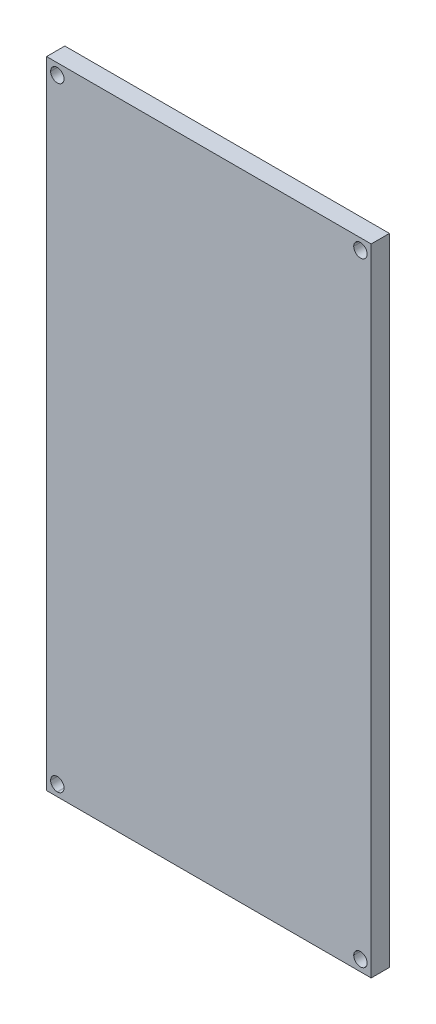
ISO-10303-21;
HEADER;
FILE_DESCRIPTION(('STEP AP214'),'2;1');
FILE_NAME('part.step','',(''),(''),'','','');
FILE_SCHEMA(('AUTOMOTIVE_DESIGN { 1 0 10303 214 1 1 1 1 }'));
ENDSEC;
DATA;
#1=APPLICATION_CONTEXT('core data for automotive mechanical design processes');
#2=APPLICATION_PROTOCOL_DEFINITION('international standard','automotive_design',2000,#1);
#3=PRODUCT_CONTEXT('',#1,'mechanical');
#4=PRODUCT('Part','Part','',(#3));
#5=PRODUCT_RELATED_PRODUCT_CATEGORY('part','',(#4));
#6=PRODUCT_DEFINITION_FORMATION('','',#4);
#7=PRODUCT_DEFINITION_CONTEXT('part definition',#1,'design');
#8=PRODUCT_DEFINITION('design','',#6,#7);
#9=PRODUCT_DEFINITION_SHAPE('','',#8);
#10=(LENGTH_UNIT() NAMED_UNIT(*) SI_UNIT(.MILLI.,.METRE.));
#11=(NAMED_UNIT(*) PLANE_ANGLE_UNIT() SI_UNIT($,.RADIAN.));
#12=(NAMED_UNIT(*) SI_UNIT($,.STERADIAN.) SOLID_ANGLE_UNIT());
#13=UNCERTAINTY_MEASURE_WITH_UNIT(LENGTH_MEASURE(1.E-05),#10,'distance_accuracy_value','');
#14=(GEOMETRIC_REPRESENTATION_CONTEXT(3) GLOBAL_UNCERTAINTY_ASSIGNED_CONTEXT((#13)) GLOBAL_UNIT_ASSIGNED_CONTEXT((#10,
#11,#12)) REPRESENTATION_CONTEXT('',''));
#15=CARTESIAN_POINT('',(0.,0.,0.));
#16=DIRECTION('',(0.,0.,1.));
#17=DIRECTION('',(1.,0.,0.));
#18=AXIS2_PLACEMENT_3D('',#15,#16,#17);
#19=CARTESIAN_POINT('',(1259.93549562021,-387.392888926091,4.5));
#20=CARTESIAN_POINT('',(1259.93549562019,-388.304113925863,4.5));
#21=CARTESIAN_POINT('',(1260.67414173114,-389.043077536789,4.50000000000039));
#22=CARTESIAN_POINT('',(1261.58568423091,-389.043077536792,4.50000000000039));
#23=CARTESIAN_POINT('',(1262.49659173068,-389.043077536789,4.50000000000039));
#24=CARTESIAN_POINT('',(1263.23590811937,-388.304113925863,4.50000000000039));
#25=CARTESIAN_POINT('',(1263.23590811938,-387.39288892609,4.50000000000039));
#26=B_SPLINE_CURVE_WITH_KNOTS('',3,(#19,#20,#21,#22,#23,#24,#25),.UNSPECIFIED.,.F.,.F.,(4,3,4),
(0.,1.,2.),.UNSPECIFIED.);
#27=DIRECTION('',(0.,0.,-1.));
#28=VECTOR('',#27,1.);
#29=SURFACE_OF_LINEAR_EXTRUSION('',#26,#28);
#30=CARTESIAN_POINT('',(1259.93549562021,-387.392888926091,4.16333634234434E-13));
#31=CARTESIAN_POINT('',(1259.93549562019,-388.304113925863,4.16333634234434E-13));
#32=CARTESIAN_POINT('',(1260.67414173114,-389.043077536789,6.93889390390723E-13));
#33=CARTESIAN_POINT('',(1261.58568423091,-389.043077536792,3.33066907387547E-13));
#34=CARTESIAN_POINT('',(1262.49659173068,-389.043077536789,3.33066907387547E-13));
#35=CARTESIAN_POINT('',(1263.23590811937,-388.304113925863,3.33066907387547E-13));
#36=CARTESIAN_POINT('',(1263.23590811938,-387.39288892609,3.33066907387547E-13));
#37=B_SPLINE_CURVE_WITH_KNOTS('',3,(#30,#31,#32,#33,#34,#35,#36),.UNSPECIFIED.,.F.,.F.,(4,3,4),
(0.,1.,2.),.UNSPECIFIED.);
#38=CARTESIAN_POINT('',(1260.41728361055,-388.558212669489,4.16333634234434E-13));
#39=VERTEX_POINT('',#38);
#40=CARTESIAN_POINT('',(1261.53167576148,-389.0422105581,3.33066907387547E-13));
#41=VERTEX_POINT('',#40);
#42=EDGE_CURVE('E206',#39,#41,#37,.T.);
#43=ORIENTED_EDGE('',*,*,#42,.F.);
#44=CARTESIAN_POINT('',(1260.41728361056,-388.55821266949,1.98625837999344E-13));
#45=CARTESIAN_POINT('',(1260.11954797213,-388.259686394422,1.01481323344643E-13));
#46=CARTESIAN_POINT('',(1259.9354956202,-387.847749300204,0.));
#47=CARTESIAN_POINT('',(1259.93549562021,-387.392888926091,0.));
#48=B_SPLINE_CURVE_WITH_KNOTS('',3,(#44,#45,#46,#47),.UNSPECIFIED.,.F.,.F.,(4,4),(0.,
0.499174599278034),.UNSPECIFIED.);
#49=CARTESIAN_POINT('',(1259.93549562021,-387.392888926091,4.16333634234434E-13));
#50=VERTEX_POINT('',#49);
#51=EDGE_CURVE('E499',#50,#39,#48,.F.);
#52=ORIENTED_EDGE('',*,*,#51,.F.);
#53=DIRECTION('',(0.,0.,-1.));
#54=VECTOR('',#53,1.);
#55=CARTESIAN_POINT('',(1259.93549562021,-387.392888926091,4.5));
#56=LINE('',#55,#54);
#57=CARTESIAN_POINT('',(1259.93549562021,-387.392888926091,4.5));
#58=VERTEX_POINT('',#57);
#59=EDGE_CURVE('E225',#58,#50,#56,.T.);
#60=ORIENTED_EDGE('',*,*,#59,.F.);
#61=CARTESIAN_POINT('',(1259.93549562021,-387.392888926091,4.5));
#62=CARTESIAN_POINT('',(1259.9354956202,-387.847749300204,4.5));
#63=CARTESIAN_POINT('',(1260.11954797213,-388.259686394421,4.5000000000001));
#64=CARTESIAN_POINT('',(1260.41728361056,-388.558212669489,4.5000000000002));
#65=B_SPLINE_CURVE_WITH_KNOTS('',3,(#61,#62,#63,#64),.UNSPECIFIED.,.F.,.F.,(4,4),(0.,
0.499174599277808),.UNSPECIFIED.);
#66=CARTESIAN_POINT('',(1260.41728361055,-388.558212669489,4.5));
#67=VERTEX_POINT('',#66);
#68=EDGE_CURVE('E217',#58,#67,#65,.T.);
#69=ORIENTED_EDGE('',*,*,#68,.T.);
#70=CARTESIAN_POINT('',(1261.53167576148,-389.0422105581,4.50000000000039));
#71=VERTEX_POINT('',#70);
#72=EDGE_CURVE('E212',#67,#71,#26,.T.);
#73=ORIENTED_EDGE('',*,*,#72,.T.);
#74=DIRECTION('',(0.,0.,-1.));
#75=VECTOR('',#74,1.);
#76=CARTESIAN_POINT('',(1261.53167576148,-389.0422105581,4.50000000000039));
#77=LINE('',#76,#75);
#78=EDGE_CURVE('E85',#41,#71,#77,.F.);
#79=ORIENTED_EDGE('',*,*,#78,.F.);
#80=EDGE_LOOP('',(#43,#52,#60,#69,#73,#79));
#81=FACE_BOUND('',#80,.T.);
#82=ADVANCED_FACE('F46',(#81),#29,.T.);
#83=DIRECTION('',(0.,0.,-1.));
#84=VECTOR('',#83,1.);
#85=CARTESIAN_POINT('',(1261.64384107452,-389.042070692619,4.50000000000039));
#86=LINE('',#85,#84);
#87=CARTESIAN_POINT('',(1261.64384107452,-389.042070692621,4.50000000000039));
#88=VERTEX_POINT('',#87);
#89=CARTESIAN_POINT('',(1261.64384107452,-389.042070692621,3.33066907387547E-13));
#90=VERTEX_POINT('',#89);
#91=EDGE_CURVE('E341',#88,#90,#86,.T.);
#92=ORIENTED_EDGE('',*,*,#91,.F.);
#93=CARTESIAN_POINT('',(1262.50676473072,-388.762131005625,4.50000000000039));
#94=VERTEX_POINT('',#93);
#95=EDGE_CURVE('E220',#88,#94,#26,.T.);
#96=ORIENTED_EDGE('',*,*,#95,.T.);
#97=DIRECTION('',(0.,0.,-1.));
#98=VECTOR('',#97,1.);
#99=CARTESIAN_POINT('',(1262.50676473072,-388.762131005624,4.50000000000039));
#100=LINE('',#99,#98);
#101=CARTESIAN_POINT('',(1262.50676473072,-388.762131005625,3.33066907387547E-13));
#102=VERTEX_POINT('',#101);
#103=EDGE_CURVE('E345',#102,#94,#100,.F.);
#104=ORIENTED_EDGE('',*,*,#103,.F.);
#105=EDGE_CURVE('E471',#90,#102,#37,.T.);
#106=ORIENTED_EDGE('',*,*,#105,.F.);
#107=EDGE_LOOP('',(#92,#96,#104,#106));
#108=FACE_BOUND('',#107,.T.);
#109=ADVANCED_FACE('F249',(#108),#29,.T.);
#110=CARTESIAN_POINT('',(1263.23590811938,-387.39288892609,4.50000000000039));
#111=CARTESIAN_POINT('',(1263.23590811937,-386.481663926319,4.50000000000039));
#112=CARTESIAN_POINT('',(1262.49659173066,-385.743017815391,4.50000000000039));
#113=CARTESIAN_POINT('',(1261.58568423089,-385.743017815392,4.50000000000039));
#114=CARTESIAN_POINT('',(1260.67414173112,-385.743017815392,4.50000000000039));
#115=CARTESIAN_POINT('',(1259.93549562019,-386.481663926323,4.5));
#116=CARTESIAN_POINT('',(1259.93549562021,-387.392888926091,4.5));
#117=B_SPLINE_CURVE_WITH_KNOTS('',3,(#110,#111,#112,#113,#114,#115,#116),.UNSPECIFIED.,.F.,.F.,
(4,3,4),(2.,3.,4.),.UNSPECIFIED.);
#118=DIRECTION('',(0.,0.,-1.));
#119=VECTOR('',#118,1.);
#120=SURFACE_OF_LINEAR_EXTRUSION('',#117,#119);
#121=DIRECTION('',(0.,0.,-1.));
#122=VECTOR('',#121,1.);
#123=CARTESIAN_POINT('',(1262.97204724083,-386.497775984394,4.50000000000039));
#124=LINE('',#123,#122);
#125=CARTESIAN_POINT('',(1262.97204724083,-386.497775984394,3.33066907387547E-13));
#126=VERTEX_POINT('',#125);
#127=CARTESIAN_POINT('',(1262.97204724083,-386.497775984394,4.50000000000039));
#128=VERTEX_POINT('',#127);
#129=EDGE_CURVE('E13',#126,#128,#124,.F.);
#130=ORIENTED_EDGE('',*,*,#129,.F.);
#131=CARTESIAN_POINT('',(1262.97204724082,-386.497775984393,3.92914867308747E-13));
#132=CARTESIAN_POINT('',(1263.13896952477,-386.755601098968,3.92914867308747E-13));
#133=CARTESIAN_POINT('',(1263.23590811938,-387.062930807137,3.92914867308747E-13));
#134=CARTESIAN_POINT('',(1263.23590811938,-387.39288892609,3.92914867308747E-13));
#135=B_SPLINE_CURVE_WITH_KNOTS('',3,(#131,#132,#133,#134),.UNSPECIFIED.,.F.,.F.,(4,4),(2.,
2.36210389205299),.UNSPECIFIED.);
#136=CARTESIAN_POINT('',(1263.23590811938,-387.39288892609,3.33066907387547E-13));
#137=VERTEX_POINT('',#136);
#138=EDGE_CURVE('E502',#137,#126,#135,.F.);
#139=ORIENTED_EDGE('',*,*,#138,.F.);
#140=DIRECTION('',(0.,0.,-1.));
#141=VECTOR('',#140,1.);
#142=CARTESIAN_POINT('',(1263.23590811938,-387.39288892609,4.50000000000039));
#143=LINE('',#142,#141);
#144=CARTESIAN_POINT('',(1263.23590811938,-387.39288892609,4.50000000000039));
#145=VERTEX_POINT('',#144);
#146=EDGE_CURVE('E433',#145,#137,#143,.T.);
#147=ORIENTED_EDGE('',*,*,#146,.F.);
#148=EDGE_CURVE('E434',#145,#128,#117,.T.);
#149=ORIENTED_EDGE('',*,*,#148,.T.);
#150=EDGE_LOOP('',(#130,#139,#147,#149));
#151=FACE_BOUND('',#150,.T.);
#152=ADVANCED_FACE('F510',(#151),#120,.T.);
#153=DIRECTION('',(0.,0.,-1.));
#154=VECTOR('',#153,1.);
#155=CARTESIAN_POINT('',(1262.32041946283,-385.91526558956,4.50000000000039));
#156=LINE('',#155,#154);
#157=CARTESIAN_POINT('',(1262.32041946283,-385.91526558956,4.50000000000039));
#158=VERTEX_POINT('',#157);
#159=CARTESIAN_POINT('',(1262.32041946283,-385.91526558956,3.33066907387547E-13));
#160=VERTEX_POINT('',#159);
#161=EDGE_CURVE('E56',#158,#160,#156,.T.);
#162=ORIENTED_EDGE('',*,*,#161,.F.);
#163=CARTESIAN_POINT('',(1261.9440393841,-385.782058428489,4.50000000000039));
#164=VERTEX_POINT('',#163);
#165=EDGE_CURVE('E330',#158,#164,#117,.T.);
#166=ORIENTED_EDGE('',*,*,#165,.T.);
#167=DIRECTION('',(0.,0.,-1.));
#168=VECTOR('',#167,1.);
#169=CARTESIAN_POINT('',(1261.9440393841,-385.782058428488,4.50000000000039));
#170=LINE('',#169,#168);
#171=CARTESIAN_POINT('',(1261.9440393841,-385.782058428489,3.33066907387547E-13));
#172=VERTEX_POINT('',#171);
#173=EDGE_CURVE('E451',#172,#164,#170,.F.);
#174=ORIENTED_EDGE('',*,*,#173,.F.);
#175=CARTESIAN_POINT('',(1263.23590811938,-387.39288892609,3.33066907387547E-13));
#176=CARTESIAN_POINT('',(1263.23590811937,-386.481663926319,3.33066907387547E-13));
#177=CARTESIAN_POINT('',(1262.49659173066,-385.743017815391,3.33066907387547E-13));
#178=CARTESIAN_POINT('',(1261.58568423089,-385.743017815392,3.33066907387547E-13));
#179=CARTESIAN_POINT('',(1260.67414173112,-385.743017815392,3.33066907387547E-13));
#180=CARTESIAN_POINT('',(1259.93549562019,-386.481663926323,4.16333634234434E-13));
#181=CARTESIAN_POINT('',(1259.93549562021,-387.392888926091,4.16333634234434E-13));
#182=B_SPLINE_CURVE_WITH_KNOTS('',3,(#175,#176,#177,#178,#179,#180,#181),.UNSPECIFIED.,.F.,.F.,
(4,3,4),(2.,3.,4.),.UNSPECIFIED.);
#183=EDGE_CURVE('E511',#160,#172,#182,.T.);
#184=ORIENTED_EDGE('',*,*,#183,.F.);
#185=EDGE_LOOP('',(#162,#166,#174,#184));
#186=FACE_BOUND('',#185,.T.);
#187=ADVANCED_FACE('F449',(#186),#120,.T.);
#188=DIRECTION('',(0.,0.,-1.));
#189=VECTOR('',#188,1.);
#190=CARTESIAN_POINT('',(1261.2684343152,-385.77346867027,4.50000000000039));
#191=LINE('',#190,#189);
#192=CARTESIAN_POINT('',(1261.2684343152,-385.77346867027,4.50000000000039));
#193=VERTEX_POINT('',#192);
#194=CARTESIAN_POINT('',(1261.2684343152,-385.77346867027,3.33066907387547E-13));
#195=VERTEX_POINT('',#194);
#196=EDGE_CURVE('E525',#193,#195,#191,.T.);
#197=ORIENTED_EDGE('',*,*,#196,.F.);
#198=CARTESIAN_POINT('',(1260.67746121099,-386.01510825709,4.50000000000039));
#199=VERTEX_POINT('',#198);
#200=EDGE_CURVE('E322',#193,#199,#117,.T.);
#201=ORIENTED_EDGE('',*,*,#200,.T.);
#202=DIRECTION('',(0.,0.,-1.));
#203=VECTOR('',#202,1.);
#204=CARTESIAN_POINT('',(1260.67746121099,-386.01510825709,4.50000000000039));
#205=LINE('',#204,#203);
#206=CARTESIAN_POINT('',(1260.67746121099,-386.01510825709,3.33066907387547E-13));
#207=VERTEX_POINT('',#206);
#208=EDGE_CURVE('E96',#207,#199,#205,.F.);
#209=ORIENTED_EDGE('',*,*,#208,.F.);
#210=EDGE_CURVE('E512',#195,#207,#182,.T.);
#211=ORIENTED_EDGE('',*,*,#210,.F.);
#212=EDGE_LOOP('',(#197,#201,#209,#211));
#213=FACE_BOUND('',#212,.T.);
#214=ADVANCED_FACE('F298',(#213),#120,.T.);
#215=CARTESIAN_POINT('',(0.,0.,4.5));
#216=DIRECTION('',(0.,0.,-1.));
#217=DIRECTION('',(-1.00000000000004,0.,0.));
#218=AXIS2_PLACEMENT_3D('',#215,#216,#217);
#219=PLANE('',#218);
#220=CARTESIAN_POINT('',(1260.2827362853,-386.38023826975,4.5));
#221=VERTEX_POINT('',#220);
#222=EDGE_CURVE('E226',#221,#58,#117,.T.);
#223=ORIENTED_EDGE('',*,*,#222,.F.);
#224=CARTESIAN_POINT('',(1261.5857018698,-387.39288892609,4.50000000000044));
#225=DIRECTION('',(0.,0.,1.));
#226=DIRECTION('',(-0.550380086750241,0.834914223204274,0.));
#227=AXIS2_PLACEMENT_3D('',#224,#225,#226);
#228=CIRCLE('',#227,1.65020624958736);
#229=EDGE_CURVE('E332',#199,#221,#228,.T.);
#230=ORIENTED_EDGE('',*,*,#229,.F.);
#231=ORIENTED_EDGE('',*,*,#200,.F.);
#232=CARTESIAN_POINT('',(1261.5857018698,-387.39288892609,4.50000000000044));
#233=DIRECTION('',(0.,0.,1.));
#234=DIRECTION('',(0.217147107770825,0.976138890520589,0.));
#235=AXIS2_PLACEMENT_3D('',#232,#233,#234);
#236=CIRCLE('',#235,1.65020624958737);
#237=EDGE_CURVE('E416',#164,#193,#236,.T.);
#238=ORIENTED_EDGE('',*,*,#237,.F.);
#239=ORIENTED_EDGE('',*,*,#165,.F.);
#240=CARTESIAN_POINT('',(1261.5857018698,-387.39288892609,4.50000000000044));
#241=DIRECTION('',(0.,0.,1.));
#242=DIRECTION('',(0.840104302949399,0.54242488896243,0.));
#243=AXIS2_PLACEMENT_3D('',#240,#241,#242);
#244=CIRCLE('',#243,1.65020624958736);
#245=EDGE_CURVE('E454',#128,#158,#244,.T.);
#246=ORIENTED_EDGE('',*,*,#245,.F.);
#247=ORIENTED_EDGE('',*,*,#148,.F.);
#248=CARTESIAN_POINT('',(1262.9454038914,-388.327977733954,4.50000000000039));
#249=VERTEX_POINT('',#248);
#250=EDGE_CURVE('E279',#249,#145,#26,.T.);
#251=ORIENTED_EDGE('',*,*,#250,.F.);
#252=CARTESIAN_POINT('',(1261.5857018698,-387.39288892609,4.50000000000044));
#253=DIRECTION('',(0.,0.,1.));
#254=DIRECTION('',(0.558150147095217,-0.829739967277453,0.));
#255=AXIS2_PLACEMENT_3D('',#252,#253,#254);
#256=CIRCLE('',#255,1.65020624958734);
#257=EDGE_CURVE('E64',#94,#249,#256,.T.);
#258=ORIENTED_EDGE('',*,*,#257,.F.);
#259=ORIENTED_EDGE('',*,*,#95,.F.);
#260=CARTESIAN_POINT('',(1261.5857018698,-387.39288892609,4.50000000000039));
#261=DIRECTION('',(0.,0.,1.));
#262=DIRECTION('',(1.00000000000004,0.,0.));
#263=AXIS2_PLACEMENT_3D('',#260,#261,#262);
#264=CIRCLE('',#263,1.65020624958734);
#265=EDGE_CURVE('E50',#71,#88,#264,.T.);
#266=ORIENTED_EDGE('',*,*,#265,.F.);
#267=ORIENTED_EDGE('',*,*,#72,.F.);
#268=ORIENTED_EDGE('',*,*,#68,.F.);
#269=EDGE_LOOP('',(#223,#230,#231,#238,#239,#246,#247,#251,#258,#259,#266,#267,#268));
#270=FACE_BOUND('',#269,.T.);
#271=CARTESIAN_POINT('',(1337.93554421182,-236.062934519471,4.49999999999973));
#272=CARTESIAN_POINT('',(1337.93554421182,-235.151709519705,4.49999999999973));
#273=CARTESIAN_POINT('',(1337.19658060088,-234.413063408776,4.49999999999973));
#274=CARTESIAN_POINT('',(1336.28570837888,-234.413063408779,4.49999999999973));
#275=CARTESIAN_POINT('',(1335.37413060133,-234.413063408779,4.49999999999973));
#276=CARTESIAN_POINT('',(1334.6355197682,-235.151709519705,4.49999999999973));
#277=CARTESIAN_POINT('',(1334.63551976818,-236.062934519474,4.49999999999973));
#278=B_SPLINE_CURVE_WITH_KNOTS('',3,(#271,#272,#273,#274,#275,#276,#277),.UNSPECIFIED.,.F.,.F.,
(4,3,4),(2.,3.,4.),.UNSPECIFIED.);
#279=CARTESIAN_POINT('',(1337.93554421182,-236.062934519471,4.49999999999973));
#280=VERTEX_POINT('',#279);
#281=CARTESIAN_POINT('',(1334.63551976818,-236.062934519474,4.49999999999973));
#282=VERTEX_POINT('',#281);
#283=EDGE_CURVE('E700',#280,#282,#278,.T.);
#284=ORIENTED_EDGE('',*,*,#283,.F.);
#285=CARTESIAN_POINT('',(1336.28553199001,-236.095453621565,4.49999999999973));
#286=DIRECTION('',(0.,0.,1.));
#287=DIRECTION('',(1.00000000000004,0.,0.));
#288=AXIS2_PLACEMENT_3D('',#285,#286,#287);
#289=CIRCLE('',#288,1.65033264044623);
#290=EDGE_CURVE('E343',#282,#280,#289,.T.);
#291=ORIENTED_EDGE('',*,*,#290,.F.);
#292=EDGE_LOOP('',(#284,#291));
#293=FACE_BOUND('',#292,.T.);
#294=DIRECTION('',(0.,1.00000000000004,0.));
#295=VECTOR('',#294,1.);
#296=CARTESIAN_POINT('',(1338.93566921157,-233.412973686804,4.49999999999973));
#297=LINE('',#296,#295);
#298=CARTESIAN_POINT('',(1338.93566921157,-390.090756980972,4.5));
#299=VERTEX_POINT('',#298);
#300=CARTESIAN_POINT('',(1338.93566921157,-233.412973686804,4.49999999999973));
#301=VERTEX_POINT('',#300);
#302=EDGE_CURVE('E716',#299,#301,#297,.T.);
#303=ORIENTED_EDGE('',*,*,#302,.T.);
#304=DIRECTION('',(-1.00000000000004,0.,0.));
#305=VECTOR('',#304,1.);
#306=CARTESIAN_POINT('',(1258.93572339822,-233.412973686807,4.5));
#307=LINE('',#306,#305);
#308=CARTESIAN_POINT('',(1258.93572339822,-233.412973686807,4.5));
#309=VERTEX_POINT('',#308);
#310=EDGE_CURVE('E719',#301,#309,#307,.T.);
#311=ORIENTED_EDGE('',*,*,#310,.T.);
#312=DIRECTION('',(0.,-1.00000000000004,0.));
#313=VECTOR('',#312,1.);
#314=CARTESIAN_POINT('',(1258.93572339822,-390.090756980975,4.5));
#315=LINE('',#314,#313);
#316=CARTESIAN_POINT('',(1258.93572339822,-390.090756980975,4.5));
#317=VERTEX_POINT('',#316);
#318=EDGE_CURVE('E722',#309,#317,#315,.T.);
#319=ORIENTED_EDGE('',*,*,#318,.T.);
#320=DIRECTION('',(1.00000000000004,0.,0.));
#321=VECTOR('',#320,1.);
#322=CARTESIAN_POINT('',(1338.93566921157,-390.090756980972,4.5));
#323=LINE('',#322,#321);
#324=EDGE_CURVE('E724',#317,#299,#323,.T.);
#325=ORIENTED_EDGE('',*,*,#324,.T.);
#326=EDGE_LOOP('',(#303,#311,#319,#325));
#327=FACE_BOUND('',#326,.T.);
#328=CARTESIAN_POINT('',(1259.93549562019,-236.062934519478,4.5));
#329=CARTESIAN_POINT('',(1259.93549562021,-236.974159519247,4.5));
#330=CARTESIAN_POINT('',(1260.67414173112,-237.713123130173,4.50000000000034));
#331=CARTESIAN_POINT('',(1261.5856842309,-237.713123130176,4.50000000000034));
#332=CARTESIAN_POINT('',(1262.49659173066,-237.713123130176,4.50000000000034));
#333=CARTESIAN_POINT('',(1263.23555534161,-236.97415951925,4.50000000000034));
#334=CARTESIAN_POINT('',(1263.23555534159,-236.062934519475,4.50000000000034));
#335=B_SPLINE_CURVE_WITH_KNOTS('',3,(#328,#329,#330,#331,#332,#333,#334),.UNSPECIFIED.,.F.,.F.,
(4,3,4),(0.,1.,2.),.UNSPECIFIED.);
#336=CARTESIAN_POINT('',(1259.93549562019,-236.062934519478,4.5));
#337=VERTEX_POINT('',#336);
#338=CARTESIAN_POINT('',(1263.23555534159,-236.062934519475,4.50000000000034));
#339=VERTEX_POINT('',#338);
#340=EDGE_CURVE('E759',#337,#339,#335,.T.);
#341=ORIENTED_EDGE('',*,*,#340,.F.);
#342=CARTESIAN_POINT('',(1263.23555534159,-236.062934519475,4.50000000000034));
#343=CARTESIAN_POINT('',(1263.23555534161,-235.151709519705,4.50000000000034));
#344=CARTESIAN_POINT('',(1262.49659173066,-234.413063408779,4.50000000000034));
#345=CARTESIAN_POINT('',(1261.58568423089,-234.413063408776,4.50000000000034));
#346=CARTESIAN_POINT('',(1260.67414173112,-234.413063408776,4.50000000000034));
#347=CARTESIAN_POINT('',(1259.93549562021,-235.151709519707,4.5));
#348=CARTESIAN_POINT('',(1259.93549562019,-236.062934519478,4.5));
#349=B_SPLINE_CURVE_WITH_KNOTS('',3,(#342,#343,#344,#345,#346,#347,#348),.UNSPECIFIED.,.F.,.F.,
(4,3,4),(2.,3.,4.),.UNSPECIFIED.);
#350=EDGE_CURVE('E797',#339,#337,#349,.T.);
#351=ORIENTED_EDGE('',*,*,#350,.F.);
#352=EDGE_LOOP('',(#341,#351));
#353=FACE_BOUND('',#352,.T.);
#354=CARTESIAN_POINT('',(1334.6355197682,-387.392888926091,4.5));
#355=CARTESIAN_POINT('',(1334.63551976818,-388.304113925867,4.5));
#356=CARTESIAN_POINT('',(1335.37413060135,-389.043077536794,4.5));
#357=CARTESIAN_POINT('',(1336.2857083789,-389.043077536794,4.5));
#358=CARTESIAN_POINT('',(1337.19658060089,-389.043077536789,4.5));
#359=CARTESIAN_POINT('',(1337.9358969896,-388.304113925866,4.5));
#360=CARTESIAN_POINT('',(1337.9358969896,-387.392888926091,4.5));
#361=B_SPLINE_CURVE_WITH_KNOTS('',3,(#354,#355,#356,#357,#358,#359,#360),.UNSPECIFIED.,.F.,.F.,
(4,3,4),(0.,1.,2.),.UNSPECIFIED.);
#362=CARTESIAN_POINT('',(1334.6355197682,-387.392888926091,4.5));
#363=VERTEX_POINT('',#362);
#364=CARTESIAN_POINT('',(1337.9358969896,-387.392888926091,4.5));
#365=VERTEX_POINT('',#364);
#366=EDGE_CURVE('E763',#363,#365,#361,.T.);
#367=ORIENTED_EDGE('',*,*,#366,.F.);
#368=CARTESIAN_POINT('',(1337.9358969896,-387.392888926091,4.5));
#369=CARTESIAN_POINT('',(1337.93589698959,-386.481663926323,4.5));
#370=CARTESIAN_POINT('',(1337.19658060089,-385.743017815392,4.5));
#371=CARTESIAN_POINT('',(1336.28570837888,-385.743017815397,4.5));
#372=CARTESIAN_POINT('',(1335.37413060134,-385.743017815395,4.5));
#373=CARTESIAN_POINT('',(1334.63551976818,-386.481663926323,4.5));
#374=CARTESIAN_POINT('',(1334.6355197682,-387.392888926091,4.5));
#375=B_SPLINE_CURVE_WITH_KNOTS('',3,(#368,#369,#370,#371,#372,#373,#374),.UNSPECIFIED.,.F.,.F.,
(4,3,4),(2.,3.,4.),.UNSPECIFIED.);
#376=EDGE_CURVE('E764',#365,#363,#375,.T.);
#377=ORIENTED_EDGE('',*,*,#376,.F.);
#378=EDGE_LOOP('',(#367,#377));
#379=FACE_BOUND('',#378,.T.);
#380=ADVANCED_FACE('F215',(#270,#293,#327,#353,#379),#219,.F.);
#381=CARTESIAN_POINT('',(0.,0.,0.));
#382=DIRECTION('',(0.,0.,-1.));
#383=DIRECTION('',(-1.00000000000004,0.,0.));
#384=AXIS2_PLACEMENT_3D('',#381,#382,#383);
#385=PLANE('',#384);
#386=CARTESIAN_POINT('',(1261.5857018698,-387.39288892609,4.39752401160121E-13));
#387=DIRECTION('',(0.,0.,-1.));
#388=DIRECTION('',(-0.789577414836348,0.613650964295136,0.));
#389=AXIS2_PLACEMENT_3D('',#386,#387,#388);
#390=CIRCLE('',#389,1.65020624958746);
#391=CARTESIAN_POINT('',(1260.2827362853,-386.38023826975,4.16333634234434E-13));
#392=VERTEX_POINT('',#391);
#393=EDGE_CURVE('E455',#392,#207,#390,.T.);
#394=ORIENTED_EDGE('',*,*,#393,.F.);
#395=EDGE_CURVE('E430',#392,#50,#182,.T.);
#396=ORIENTED_EDGE('',*,*,#395,.T.);
#397=ORIENTED_EDGE('',*,*,#51,.T.);
#398=ORIENTED_EDGE('',*,*,#42,.T.);
#399=CARTESIAN_POINT('',(1261.5857018698,-387.39288892609,3.33066907387547E-13));
#400=DIRECTION('',(0.,0.,1.));
#401=DIRECTION('',(1.00000000000004,0.,0.));
#402=AXIS2_PLACEMENT_3D('',#399,#400,#401);
#403=CIRCLE('',#402,1.65020624958734);
#404=EDGE_CURVE('E335',#90,#41,#403,.F.);
#405=ORIENTED_EDGE('',*,*,#404,.F.);
#406=ORIENTED_EDGE('',*,*,#105,.T.);
#407=CARTESIAN_POINT('',(1261.5857018698,-387.39288892609,4.39752401160121E-13));
#408=DIRECTION('',(0.,0.,-1.));
#409=DIRECTION('',(0.823958836633481,-0.566649658548914,0.));
#410=AXIS2_PLACEMENT_3D('',#407,#408,#409);
#411=CIRCLE('',#410,1.65020624958747);
#412=CARTESIAN_POINT('',(1262.9454038914,-388.327977733954,3.33066907387547E-13));
#413=VERTEX_POINT('',#412);
#414=EDGE_CURVE('E348',#413,#102,#411,.T.);
#415=ORIENTED_EDGE('',*,*,#414,.F.);
#416=EDGE_CURVE('E468',#413,#137,#37,.T.);
#417=ORIENTED_EDGE('',*,*,#416,.T.);
#418=ORIENTED_EDGE('',*,*,#138,.T.);
#419=CARTESIAN_POINT('',(1261.5857018698,-387.39288892609,4.39752401160121E-13));
#420=DIRECTION('',(0.,0.,-1.));
#421=DIRECTION('',(0.445227736363146,0.895417367920094,0.));
#422=AXIS2_PLACEMENT_3D('',#419,#420,#421);
#423=CIRCLE('',#422,1.6502062495874);
#424=EDGE_CURVE('E458',#160,#126,#423,.T.);
#425=ORIENTED_EDGE('',*,*,#424,.F.);
#426=ORIENTED_EDGE('',*,*,#183,.T.);
#427=CARTESIAN_POINT('',(1261.5857018698,-387.39288892609,4.39752401160121E-13));
#428=DIRECTION('',(0.,0.,-1.));
#429=DIRECTION('',(-0.192259334054447,0.981344153938332,0.));
#430=AXIS2_PLACEMENT_3D('',#427,#428,#429);
#431=CIRCLE('',#430,1.65020624958737);
#432=EDGE_CURVE('E457',#195,#172,#431,.T.);
#433=ORIENTED_EDGE('',*,*,#432,.F.);
#434=ORIENTED_EDGE('',*,*,#210,.T.);
#435=EDGE_LOOP('',(#394,#396,#397,#398,#405,#406,#415,#417,#418,#425,#426,#433,#434));
#436=FACE_BOUND('',#435,.T.);
#437=CARTESIAN_POINT('',(1336.28553199001,-236.095453621565,-2.77555756156289E-13));
#438=DIRECTION('',(0.,0.,-1.));
#439=DIRECTION('',(-1.00000000000004,0.,0.));
#440=AXIS2_PLACEMENT_3D('',#437,#438,#439);
#441=CIRCLE('',#440,1.65033264044623);
#442=CARTESIAN_POINT('',(1337.93554421182,-236.062934519471,-2.77555756156289E-13));
#443=VERTEX_POINT('',#442);
#444=CARTESIAN_POINT('',(1334.63551976818,-236.062934519474,-2.77555756156289E-13));
#445=VERTEX_POINT('',#444);
#446=EDGE_CURVE('E686',#443,#445,#441,.T.);
#447=ORIENTED_EDGE('',*,*,#446,.F.);
#448=CARTESIAN_POINT('',(1337.93554421182,-236.062934519471,-2.77555756156289E-13));
#449=CARTESIAN_POINT('',(1337.93554421182,-235.151709519705,-2.77555756156289E-13));
#450=CARTESIAN_POINT('',(1337.19658060088,-234.413063408776,-2.77555756156289E-13));
#451=CARTESIAN_POINT('',(1336.28570837888,-234.413063408779,-2.77555756156289E-13));
#452=CARTESIAN_POINT('',(1335.37413060133,-234.413063408779,-2.77555756156289E-13));
#453=CARTESIAN_POINT('',(1334.6355197682,-235.151709519705,-2.77555756156289E-13));
#454=CARTESIAN_POINT('',(1334.63551976818,-236.062934519474,-2.77555756156289E-13));
#455=B_SPLINE_CURVE_WITH_KNOTS('',3,(#448,#449,#450,#451,#452,#453,#454),.UNSPECIFIED.,.F.,.F.,
(4,3,4),(2.,3.,4.),.UNSPECIFIED.);
#456=EDGE_CURVE('E697',#443,#445,#455,.T.);
#457=ORIENTED_EDGE('',*,*,#456,.T.);
#458=EDGE_LOOP('',(#447,#457));
#459=FACE_BOUND('',#458,.T.);
#460=DIRECTION('',(0.,1.00000000000004,0.));
#461=VECTOR('',#460,1.);
#462=CARTESIAN_POINT('',(1338.93566921157,-233.412973686804,-2.77555756156289E-13));
#463=LINE('',#462,#461);
#464=CARTESIAN_POINT('',(1338.93566921157,-390.090756980972,0.));
#465=VERTEX_POINT('',#464);
#466=CARTESIAN_POINT('',(1338.93566921157,-233.412973686804,-2.77555756156289E-13));
#467=VERTEX_POINT('',#466);
#468=EDGE_CURVE('E692',#465,#467,#463,.T.);
#469=ORIENTED_EDGE('',*,*,#468,.F.);
#470=DIRECTION('',(1.00000000000004,0.,0.));
#471=VECTOR('',#470,1.);
#472=CARTESIAN_POINT('',(1338.93566921157,-390.090756980972,0.));
#473=LINE('',#472,#471);
#474=CARTESIAN_POINT('',(1258.93572339822,-390.090756980975,4.16333634234434E-13));
#475=VERTEX_POINT('',#474);
#476=EDGE_CURVE('E720',#475,#465,#473,.T.);
#477=ORIENTED_EDGE('',*,*,#476,.F.);
#478=DIRECTION('',(0.,-1.00000000000004,0.));
#479=VECTOR('',#478,1.);
#480=CARTESIAN_POINT('',(1258.93572339822,-390.090756980975,4.16333634234434E-13));
#481=LINE('',#480,#479);
#482=CARTESIAN_POINT('',(1258.93572339822,-233.412973686807,0.));
#483=VERTEX_POINT('',#482);
#484=EDGE_CURVE('E731',#483,#475,#481,.T.);
#485=ORIENTED_EDGE('',*,*,#484,.F.);
#486=DIRECTION('',(-1.00000000000004,0.,0.));
#487=VECTOR('',#486,1.);
#488=CARTESIAN_POINT('',(1258.93572339822,-233.412973686807,0.));
#489=LINE('',#488,#487);
#490=EDGE_CURVE('E729',#467,#483,#489,.T.);
#491=ORIENTED_EDGE('',*,*,#490,.F.);
#492=EDGE_LOOP('',(#469,#477,#485,#491));
#493=FACE_BOUND('',#492,.T.);
#494=CARTESIAN_POINT('',(1263.23555534159,-236.062934519475,3.33066907387547E-13));
#495=CARTESIAN_POINT('',(1263.23555534161,-235.151709519705,3.33066907387547E-13));
#496=CARTESIAN_POINT('',(1262.49659173066,-234.413063408779,3.33066907387547E-13));
#497=CARTESIAN_POINT('',(1261.58568423089,-234.413063408776,3.33066907387547E-13));
#498=CARTESIAN_POINT('',(1260.67414173112,-234.413063408776,3.33066907387547E-13));
#499=CARTESIAN_POINT('',(1259.93549562021,-235.151709519707,0.));
#500=CARTESIAN_POINT('',(1259.93549562019,-236.062934519478,0.));
#501=B_SPLINE_CURVE_WITH_KNOTS('',3,(#494,#495,#496,#497,#498,#499,#500),.UNSPECIFIED.,.F.,.F.,
(4,3,4),(2.,3.,4.),.UNSPECIFIED.);
#502=CARTESIAN_POINT('',(1263.23555534159,-236.062934519475,3.33066907387547E-13));
#503=VERTEX_POINT('',#502);
#504=CARTESIAN_POINT('',(1259.93549562019,-236.062934519478,0.));
#505=VERTEX_POINT('',#504);
#506=EDGE_CURVE('E799',#503,#505,#501,.T.);
#507=ORIENTED_EDGE('',*,*,#506,.T.);
#508=CARTESIAN_POINT('',(1259.93549562019,-236.062934519478,0.));
#509=CARTESIAN_POINT('',(1259.93549562021,-236.974159519247,0.));
#510=CARTESIAN_POINT('',(1260.67414173112,-237.713123130173,3.33066907387547E-13));
#511=CARTESIAN_POINT('',(1261.5856842309,-237.713123130176,3.33066907387547E-13));
#512=CARTESIAN_POINT('',(1262.49659173066,-237.713123130176,3.33066907387547E-13));
#513=CARTESIAN_POINT('',(1263.23555534161,-236.97415951925,3.33066907387547E-13));
#514=CARTESIAN_POINT('',(1263.23555534159,-236.062934519475,3.33066907387547E-13));
#515=B_SPLINE_CURVE_WITH_KNOTS('',3,(#508,#509,#510,#511,#512,#513,#514),.UNSPECIFIED.,.F.,.F.,
(4,3,4),(0.,1.,2.),.UNSPECIFIED.);
#516=EDGE_CURVE('E437',#505,#503,#515,.T.);
#517=ORIENTED_EDGE('',*,*,#516,.T.);
#518=EDGE_LOOP('',(#507,#517));
#519=FACE_BOUND('',#518,.T.);
#520=CARTESIAN_POINT('',(1337.9358969896,-387.392888926091,0.));
#521=CARTESIAN_POINT('',(1337.93589698959,-386.481663926323,0.));
#522=CARTESIAN_POINT('',(1337.19658060089,-385.743017815392,0.));
#523=CARTESIAN_POINT('',(1336.28570837888,-385.743017815397,0.));
#524=CARTESIAN_POINT('',(1335.37413060134,-385.743017815395,0.));
#525=CARTESIAN_POINT('',(1334.63551976818,-386.481663926323,0.));
#526=CARTESIAN_POINT('',(1334.6355197682,-387.392888926091,0.));
#527=B_SPLINE_CURVE_WITH_KNOTS('',3,(#520,#521,#522,#523,#524,#525,#526),.UNSPECIFIED.,.F.,.F.,
(4,3,4),(2.,3.,4.),.UNSPECIFIED.);
#528=CARTESIAN_POINT('',(1337.9358969896,-387.392888926091,0.));
#529=VERTEX_POINT('',#528);
#530=CARTESIAN_POINT('',(1334.6355197682,-387.392888926091,0.));
#531=VERTEX_POINT('',#530);
#532=EDGE_CURVE('E766',#529,#531,#527,.T.);
#533=ORIENTED_EDGE('',*,*,#532,.T.);
#534=CARTESIAN_POINT('',(1334.6355197682,-387.392888926091,0.));
#535=CARTESIAN_POINT('',(1334.63551976818,-388.304113925867,0.));
#536=CARTESIAN_POINT('',(1335.37413060135,-389.043077536794,0.));
#537=CARTESIAN_POINT('',(1336.2857083789,-389.043077536794,0.));
#538=CARTESIAN_POINT('',(1337.19658060089,-389.043077536789,0.));
#539=CARTESIAN_POINT('',(1337.9358969896,-388.304113925866,0.));
#540=CARTESIAN_POINT('',(1337.9358969896,-387.392888926091,0.));
#541=B_SPLINE_CURVE_WITH_KNOTS('',3,(#534,#535,#536,#537,#538,#539,#540),.UNSPECIFIED.,.F.,.F.,
(4,3,4),(0.,1.,2.),.UNSPECIFIED.);
#542=EDGE_CURVE('E698',#531,#529,#541,.T.);
#543=ORIENTED_EDGE('',*,*,#542,.T.);
#544=EDGE_LOOP('',(#533,#543));
#545=FACE_BOUND('',#544,.T.);
#546=ADVANCED_FACE('F297',(#436,#459,#493,#519,#545),#385,.T.);
#547=CARTESIAN_POINT('',(1338.93566921157,-233.412973686804,4.49999999999973));
#548=DIRECTION('',(-1.00000000000004,0.,0.));
#549=DIRECTION('',(0.,0.,1.));
#550=AXIS2_PLACEMENT_3D('',#547,#548,#549);
#551=PLANE('',#550);
#552=ORIENTED_EDGE('',*,*,#468,.T.);
#553=DIRECTION('',(0.,0.,-1.));
#554=VECTOR('',#553,1.);
#555=CARTESIAN_POINT('',(1338.93566921157,-233.412973686804,4.49999999999973));
#556=LINE('',#555,#554);
#557=EDGE_CURVE('E431',#301,#467,#556,.T.);
#558=ORIENTED_EDGE('',*,*,#557,.F.);
#559=ORIENTED_EDGE('',*,*,#302,.F.);
#560=DIRECTION('',(0.,0.,-1.));
#561=VECTOR('',#560,1.);
#562=CARTESIAN_POINT('',(1338.93566921157,-390.090756980972,4.5));
#563=LINE('',#562,#561);
#564=EDGE_CURVE('E726',#299,#465,#563,.T.);
#565=ORIENTED_EDGE('',*,*,#564,.T.);
#566=EDGE_LOOP('',(#552,#558,#559,#565));
#567=FACE_BOUND('',#566,.T.);
#568=ADVANCED_FACE('F48',(#567),#551,.F.);
#569=CARTESIAN_POINT('',(1258.93572339822,-233.412973686807,4.5));
#570=DIRECTION('',(0.,-1.00000000000004,0.));
#571=DIRECTION('',(0.,0.,-1.));
#572=AXIS2_PLACEMENT_3D('',#569,#570,#571);
#573=PLANE('',#572);
#574=ORIENTED_EDGE('',*,*,#490,.T.);
#575=DIRECTION('',(0.,0.,-1.));
#576=VECTOR('',#575,1.);
#577=CARTESIAN_POINT('',(1258.93572339822,-233.412973686807,4.5));
#578=LINE('',#577,#576);
#579=EDGE_CURVE('E739',#309,#483,#578,.T.);
#580=ORIENTED_EDGE('',*,*,#579,.F.);
#581=ORIENTED_EDGE('',*,*,#310,.F.);
#582=ORIENTED_EDGE('',*,*,#557,.T.);
#583=EDGE_LOOP('',(#574,#580,#581,#582));
#584=FACE_BOUND('',#583,.T.);
#585=ADVANCED_FACE('F591',(#584),#573,.F.);
#586=CARTESIAN_POINT('',(1258.93572339822,-390.090756980975,4.5));
#587=DIRECTION('',(1.00000000000004,0.,0.));
#588=DIRECTION('',(0.,0.,-1.));
#589=AXIS2_PLACEMENT_3D('',#586,#587,#588);
#590=PLANE('',#589);
#591=ORIENTED_EDGE('',*,*,#484,.T.);
#592=DIRECTION('',(0.,0.,-1.));
#593=VECTOR('',#592,1.);
#594=CARTESIAN_POINT('',(1258.93572339822,-390.090756980975,4.5));
#595=LINE('',#594,#593);
#596=EDGE_CURVE('E736',#317,#475,#595,.T.);
#597=ORIENTED_EDGE('',*,*,#596,.F.);
#598=ORIENTED_EDGE('',*,*,#318,.F.);
#599=ORIENTED_EDGE('',*,*,#579,.T.);
#600=EDGE_LOOP('',(#591,#597,#598,#599));
#601=FACE_BOUND('',#600,.T.);
#602=ADVANCED_FACE('F598',(#601),#590,.F.);
#603=CARTESIAN_POINT('',(1338.93566921157,-390.090756980972,4.5));
#604=DIRECTION('',(0.,1.00000000000004,0.));
#605=DIRECTION('',(0.,0.,1.));
#606=AXIS2_PLACEMENT_3D('',#603,#604,#605);
#607=PLANE('',#606);
#608=ORIENTED_EDGE('',*,*,#476,.T.);
#609=ORIENTED_EDGE('',*,*,#564,.F.);
#610=ORIENTED_EDGE('',*,*,#324,.F.);
#611=ORIENTED_EDGE('',*,*,#596,.T.);
#612=EDGE_LOOP('',(#608,#609,#610,#611));
#613=FACE_BOUND('',#612,.T.);
#614=ADVANCED_FACE('F605',(#613),#607,.F.);
#615=DIRECTION('',(0.,0.,-1.));
#616=VECTOR('',#615,1.);
#617=SURFACE_OF_LINEAR_EXTRUSION('',#278,#616);
#618=ORIENTED_EDGE('',*,*,#456,.F.);
#619=DIRECTION('',(0.,0.,-1.));
#620=VECTOR('',#619,1.);
#621=CARTESIAN_POINT('',(1337.93554421182,-236.062934519471,4.49999999999973));
#622=LINE('',#621,#620);
#623=EDGE_CURVE('E684',#280,#443,#622,.T.);
#624=ORIENTED_EDGE('',*,*,#623,.F.);
#625=ORIENTED_EDGE('',*,*,#283,.T.);
#626=DIRECTION('',(0.,0.,-1.));
#627=VECTOR('',#626,1.);
#628=CARTESIAN_POINT('',(1334.63551976818,-236.062934519474,4.49999999999973));
#629=LINE('',#628,#627);
#630=EDGE_CURVE('E693',#282,#445,#629,.T.);
#631=ORIENTED_EDGE('',*,*,#630,.T.);
#632=EDGE_LOOP('',(#618,#624,#625,#631));
#633=FACE_BOUND('',#632,.T.);
#634=ADVANCED_FACE('F299',(#633),#617,.T.);
#635=DIRECTION('',(0.,0.,-1.));
#636=VECTOR('',#635,1.);
#637=SURFACE_OF_LINEAR_EXTRUSION('',#335,#636);
#638=ORIENTED_EDGE('',*,*,#516,.F.);
#639=DIRECTION('',(0.,0.,-1.));
#640=VECTOR('',#639,1.);
#641=CARTESIAN_POINT('',(1259.93549562019,-236.062934519478,4.5));
#642=LINE('',#641,#640);
#643=EDGE_CURVE('E704',#337,#505,#642,.T.);
#644=ORIENTED_EDGE('',*,*,#643,.F.);
#645=ORIENTED_EDGE('',*,*,#340,.T.);
#646=DIRECTION('',(0.,0.,-1.));
#647=VECTOR('',#646,1.);
#648=CARTESIAN_POINT('',(1263.23555534159,-236.062934519475,4.50000000000034));
#649=LINE('',#648,#647);
#650=EDGE_CURVE('E701',#339,#503,#649,.T.);
#651=ORIENTED_EDGE('',*,*,#650,.T.);
#652=EDGE_LOOP('',(#638,#644,#645,#651));
#653=FACE_BOUND('',#652,.T.);
#654=ADVANCED_FACE('F619',(#653),#637,.T.);
#655=DIRECTION('',(0.,0.,-1.));
#656=VECTOR('',#655,1.);
#657=SURFACE_OF_LINEAR_EXTRUSION('',#349,#656);
#658=ORIENTED_EDGE('',*,*,#506,.F.);
#659=ORIENTED_EDGE('',*,*,#650,.F.);
#660=ORIENTED_EDGE('',*,*,#350,.T.);
#661=ORIENTED_EDGE('',*,*,#643,.T.);
#662=EDGE_LOOP('',(#658,#659,#660,#661));
#663=FACE_BOUND('',#662,.T.);
#664=ADVANCED_FACE('F247',(#663),#657,.T.);
#665=DIRECTION('',(0.,0.,-1.));
#666=VECTOR('',#665,1.);
#667=CARTESIAN_POINT('',(1262.9454038914,-388.327977733954,4.50000000000039));
#668=LINE('',#667,#666);
#669=EDGE_CURVE('E361',#249,#413,#668,.T.);
#670=ORIENTED_EDGE('',*,*,#669,.F.);
#671=ORIENTED_EDGE('',*,*,#250,.T.);
#672=ORIENTED_EDGE('',*,*,#146,.T.);
#673=ORIENTED_EDGE('',*,*,#416,.F.);
#674=EDGE_LOOP('',(#670,#671,#672,#673));
#675=FACE_BOUND('',#674,.T.);
#676=ADVANCED_FACE('F235',(#675),#29,.T.);
#677=DIRECTION('',(0.,0.,-1.));
#678=VECTOR('',#677,1.);
#679=CARTESIAN_POINT('',(1260.2827362853,-386.38023826975,4.5));
#680=LINE('',#679,#678);
#681=EDGE_CURVE('E426',#221,#392,#680,.T.);
#682=ORIENTED_EDGE('',*,*,#681,.F.);
#683=ORIENTED_EDGE('',*,*,#222,.T.);
#684=ORIENTED_EDGE('',*,*,#59,.T.);
#685=ORIENTED_EDGE('',*,*,#395,.F.);
#686=EDGE_LOOP('',(#682,#683,#684,#685));
#687=FACE_BOUND('',#686,.T.);
#688=ADVANCED_FACE('F246',(#687),#120,.T.);
#689=DIRECTION('',(0.,0.,-1.));
#690=VECTOR('',#689,1.);
#691=SURFACE_OF_LINEAR_EXTRUSION('',#361,#690);
#692=ORIENTED_EDGE('',*,*,#542,.F.);
#693=DIRECTION('',(0.,0.,-1.));
#694=VECTOR('',#693,1.);
#695=CARTESIAN_POINT('',(1334.6355197682,-387.392888926091,4.5));
#696=LINE('',#695,#694);
#697=EDGE_CURVE('E476',#363,#531,#696,.T.);
#698=ORIENTED_EDGE('',*,*,#697,.F.);
#699=ORIENTED_EDGE('',*,*,#366,.T.);
#700=DIRECTION('',(0.,0.,-1.));
#701=VECTOR('',#700,1.);
#702=CARTESIAN_POINT('',(1337.9358969896,-387.392888926091,4.5));
#703=LINE('',#702,#701);
#704=EDGE_CURVE('E260',#365,#529,#703,.T.);
#705=ORIENTED_EDGE('',*,*,#704,.T.);
#706=EDGE_LOOP('',(#692,#698,#699,#705));
#707=FACE_BOUND('',#706,.T.);
#708=ADVANCED_FACE('F564',(#707),#691,.T.);
#709=DIRECTION('',(0.,0.,-1.));
#710=VECTOR('',#709,1.);
#711=SURFACE_OF_LINEAR_EXTRUSION('',#375,#710);
#712=ORIENTED_EDGE('',*,*,#532,.F.);
#713=ORIENTED_EDGE('',*,*,#704,.F.);
#714=ORIENTED_EDGE('',*,*,#376,.T.);
#715=ORIENTED_EDGE('',*,*,#697,.T.);
#716=EDGE_LOOP('',(#712,#713,#714,#715));
#717=FACE_BOUND('',#716,.T.);
#718=ADVANCED_FACE('F568',(#717),#711,.T.);
#719=CARTESIAN_POINT('',(1336.28553199001,-236.095453621565,-5.50000000000028));
#720=DIRECTION('',(0.,0.,1.));
#721=DIRECTION('',(1.00000000000004,0.,0.));
#722=AXIS2_PLACEMENT_3D('',#719,#720,#721);
#723=CYLINDRICAL_SURFACE('',#722,1.65033264044623);
#724=ORIENTED_EDGE('',*,*,#623,.T.);
#725=ORIENTED_EDGE('',*,*,#446,.T.);
#726=ORIENTED_EDGE('',*,*,#630,.F.);
#727=ORIENTED_EDGE('',*,*,#290,.T.);
#728=EDGE_LOOP('',(#724,#725,#726,#727));
#729=FACE_BOUND('',#728,.T.);
#730=ADVANCED_FACE('F372',(#729),#723,.F.);
#731=CARTESIAN_POINT('',(1261.5857018698,-387.39288892609,-5.49999999999956));
#732=DIRECTION('',(0.,0.,1.));
#733=DIRECTION('',(1.00000000000004,0.,0.));
#734=AXIS2_PLACEMENT_3D('',#731,#732,#733);
#735=CYLINDRICAL_SURFACE('',#734,1.65020624958734);
#736=ORIENTED_EDGE('',*,*,#208,.T.);
#737=ORIENTED_EDGE('',*,*,#229,.T.);
#738=ORIENTED_EDGE('',*,*,#681,.T.);
#739=ORIENTED_EDGE('',*,*,#393,.T.);
#740=EDGE_LOOP('',(#736,#737,#738,#739));
#741=FACE_BOUND('',#740,.T.);
#742=ADVANCED_FACE('F362',(#741),#735,.F.);
#743=ORIENTED_EDGE('',*,*,#173,.T.);
#744=ORIENTED_EDGE('',*,*,#237,.T.);
#745=ORIENTED_EDGE('',*,*,#196,.T.);
#746=ORIENTED_EDGE('',*,*,#432,.T.);
#747=EDGE_LOOP('',(#743,#744,#745,#746));
#748=FACE_BOUND('',#747,.T.);
#749=ADVANCED_FACE('F371',(#748),#735,.F.);
#750=ORIENTED_EDGE('',*,*,#129,.T.);
#751=ORIENTED_EDGE('',*,*,#245,.T.);
#752=ORIENTED_EDGE('',*,*,#161,.T.);
#753=ORIENTED_EDGE('',*,*,#424,.T.);
#754=EDGE_LOOP('',(#750,#751,#752,#753));
#755=FACE_BOUND('',#754,.T.);
#756=ADVANCED_FACE('F548',(#755),#735,.F.);
#757=ORIENTED_EDGE('',*,*,#103,.T.);
#758=ORIENTED_EDGE('',*,*,#257,.T.);
#759=ORIENTED_EDGE('',*,*,#669,.T.);
#760=ORIENTED_EDGE('',*,*,#414,.T.);
#761=EDGE_LOOP('',(#757,#758,#759,#760));
#762=FACE_BOUND('',#761,.T.);
#763=ADVANCED_FACE('F461',(#762),#735,.F.);
#764=ORIENTED_EDGE('',*,*,#78,.T.);
#765=ORIENTED_EDGE('',*,*,#265,.T.);
#766=ORIENTED_EDGE('',*,*,#91,.T.);
#767=ORIENTED_EDGE('',*,*,#404,.T.);
#768=EDGE_LOOP('',(#764,#765,#766,#767));
#769=FACE_BOUND('',#768,.T.);
#770=ADVANCED_FACE('F373',(#769),#735,.F.);
#771=CLOSED_SHELL('',(#82,#109,#152,#187,#214,#380,#546,#568,#585,#602,#614,#634,#654,#664,#676,
#688,#708,#718,#730,#742,#749,#756,#763,#770));
#772=MANIFOLD_SOLID_BREP('B2',#771);
#773=ADVANCED_BREP_SHAPE_REPRESENTATION('',(#18,#772),#14);
#774=SHAPE_DEFINITION_REPRESENTATION(#9,#773);
ENDSEC;
END-ISO-10303-21;
